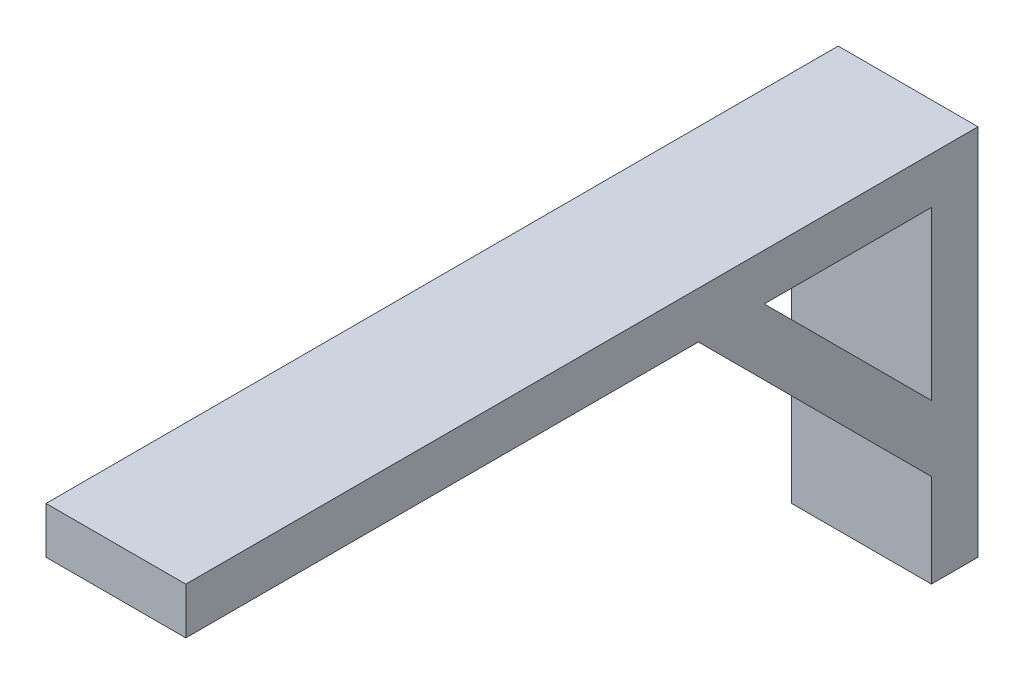
ISO-10303-21;
HEADER;
FILE_DESCRIPTION(('STEP AP214'),'2;1');
FILE_NAME('part.step','',(''),(''),'','','');
FILE_SCHEMA(('AUTOMOTIVE_DESIGN { 1 0 10303 214 1 1 1 1 }'));
ENDSEC;
DATA;
#1=APPLICATION_CONTEXT('core data for automotive mechanical design processes');
#2=APPLICATION_PROTOCOL_DEFINITION('international standard','automotive_design',2000,#1);
#3=PRODUCT_CONTEXT('',#1,'mechanical');
#4=PRODUCT('Part','Part','',(#3));
#5=PRODUCT_RELATED_PRODUCT_CATEGORY('part','',(#4));
#6=PRODUCT_DEFINITION_FORMATION('','',#4);
#7=PRODUCT_DEFINITION_CONTEXT('part definition',#1,'design');
#8=PRODUCT_DEFINITION('design','',#6,#7);
#9=PRODUCT_DEFINITION_SHAPE('','',#8);
#10=(LENGTH_UNIT() NAMED_UNIT(*) SI_UNIT(.MILLI.,.METRE.));
#11=(NAMED_UNIT(*) PLANE_ANGLE_UNIT() SI_UNIT($,.RADIAN.));
#12=(NAMED_UNIT(*) SI_UNIT($,.STERADIAN.) SOLID_ANGLE_UNIT());
#13=UNCERTAINTY_MEASURE_WITH_UNIT(LENGTH_MEASURE(1.E-05),#10,'distance_accuracy_value','');
#14=(GEOMETRIC_REPRESENTATION_CONTEXT(3) GLOBAL_UNCERTAINTY_ASSIGNED_CONTEXT((#13)) GLOBAL_UNIT_ASSIGNED_CONTEXT((#10,
#11,#12)) REPRESENTATION_CONTEXT('',''));
#15=CARTESIAN_POINT('',(0.,0.,0.));
#16=DIRECTION('',(0.,0.,1.));
#17=DIRECTION('',(1.,0.,0.));
#18=AXIS2_PLACEMENT_3D('',#15,#16,#17);
#19=CARTESIAN_POINT('',(76.2,0.,0.));
#20=DIRECTION('',(1.,0.,0.));
#21=DIRECTION('',(0.,0.,-1.));
#22=AXIS2_PLACEMENT_3D('',#19,#20,#21);
#23=PLANE('',#22);
#24=DIRECTION('',(0.,0.,-1.));
#25=VECTOR('',#24,1.);
#26=CARTESIAN_POINT('',(76.2,0.,25.4));
#27=LINE('',#26,#25);
#28=CARTESIAN_POINT('',(76.2,0.,25.4));
#29=VERTEX_POINT('',#28);
#30=CARTESIAN_POINT('',(76.2,0.,0.));
#31=VERTEX_POINT('',#30);
#32=EDGE_CURVE('E143',#29,#31,#27,.T.);
#33=ORIENTED_EDGE('',*,*,#32,.T.);
#34=DIRECTION('',(0.,1.,0.));
#35=VECTOR('',#34,1.);
#36=CARTESIAN_POINT('',(76.2,0.,0.));
#37=LINE('',#36,#35);
#38=CARTESIAN_POINT('',(76.2,203.2,0.));
#39=VERTEX_POINT('',#38);
#40=EDGE_CURVE('E146',#31,#39,#37,.T.);
#41=ORIENTED_EDGE('',*,*,#40,.T.);
#42=DIRECTION('',(0.,0.,1.));
#43=VECTOR('',#42,1.);
#44=CARTESIAN_POINT('',(76.2,203.2,0.));
#45=LINE('',#44,#43);
#46=CARTESIAN_POINT('',(76.2,203.2,431.8));
#47=VERTEX_POINT('',#46);
#48=EDGE_CURVE('E149',#39,#47,#45,.T.);
#49=ORIENTED_EDGE('',*,*,#48,.T.);
#50=DIRECTION('',(0.,-1.,0.));
#51=VECTOR('',#50,1.);
#52=CARTESIAN_POINT('',(76.2,203.2,431.8));
#53=LINE('',#52,#51);
#54=CARTESIAN_POINT('',(76.2,177.8,431.8));
#55=VERTEX_POINT('',#54);
#56=EDGE_CURVE('E151',#47,#55,#53,.T.);
#57=ORIENTED_EDGE('',*,*,#56,.T.);
#58=DIRECTION('',(0.,0.,-1.));
#59=VECTOR('',#58,1.);
#60=CARTESIAN_POINT('',(76.2,177.8,431.8));
#61=LINE('',#60,#59);
#62=CARTESIAN_POINT('',(76.2,177.8,152.4));
#63=VERTEX_POINT('',#62);
#64=EDGE_CURVE('E153',#55,#63,#61,.T.);
#65=ORIENTED_EDGE('',*,*,#64,.T.);
#66=DIRECTION('',(0.,-0.707106781186549,-0.707106781186546));
#67=VECTOR('',#66,1.);
#68=CARTESIAN_POINT('',(76.2,177.8,152.4));
#69=LINE('',#68,#67);
#70=CARTESIAN_POINT('',(76.2,50.8,25.4));
#71=VERTEX_POINT('',#70);
#72=EDGE_CURVE('E155',#63,#71,#69,.T.);
#73=ORIENTED_EDGE('',*,*,#72,.T.);
#74=DIRECTION('',(0.,-1.,0.));
#75=VECTOR('',#74,1.);
#76=CARTESIAN_POINT('',(76.2,50.8,25.4));
#77=LINE('',#76,#75);
#78=EDGE_CURVE('E157',#71,#29,#77,.T.);
#79=ORIENTED_EDGE('',*,*,#78,.T.);
#80=EDGE_LOOP('',(#33,#41,#49,#57,#65,#73,#79));
#81=FACE_BOUND('',#80,.T.);
#82=DIRECTION('',(0.,1.,0.));
#83=VECTOR('',#82,1.);
#84=CARTESIAN_POINT('',(76.2,177.8,25.4));
#85=LINE('',#84,#83);
#86=CARTESIAN_POINT('',(76.2,86.7210244842767,25.4));
#87=VERTEX_POINT('',#86);
#88=CARTESIAN_POINT('',(76.2,177.8,25.4));
#89=VERTEX_POINT('',#88);
#90=EDGE_CURVE('E124',#87,#89,#85,.T.);
#91=ORIENTED_EDGE('',*,*,#90,.F.);
#92=DIRECTION('',(0.,-0.707106781186549,-0.707106781186546));
#93=VECTOR('',#92,1.);
#94=CARTESIAN_POINT('',(76.2,86.7210244842767,25.4));
#95=LINE('',#94,#93);
#96=CARTESIAN_POINT('',(76.2,177.8,116.478975515723));
#97=VERTEX_POINT('',#96);
#98=EDGE_CURVE('E116',#97,#87,#95,.T.);
#99=ORIENTED_EDGE('',*,*,#98,.F.);
#100=DIRECTION('',(0.,0.,1.));
#101=VECTOR('',#100,1.);
#102=CARTESIAN_POINT('',(76.2,177.8,116.478975515723));
#103=LINE('',#102,#101);
#104=EDGE_CURVE('E133',#89,#97,#103,.T.);
#105=ORIENTED_EDGE('',*,*,#104,.F.);
#106=EDGE_LOOP('',(#91,#99,#105));
#107=FACE_BOUND('',#106,.T.);
#108=ADVANCED_FACE('F39',(#81,#107),#23,.T.);
#109=CARTESIAN_POINT('',(0.,0.,0.));
#110=DIRECTION('',(1.,0.,0.));
#111=DIRECTION('',(0.,0.,-1.));
#112=AXIS2_PLACEMENT_3D('',#109,#110,#111);
#113=PLANE('',#112);
#114=DIRECTION('',(0.,0.,-1.));
#115=VECTOR('',#114,1.);
#116=CARTESIAN_POINT('',(0.,0.,25.4));
#117=LINE('',#116,#115);
#118=CARTESIAN_POINT('',(0.,0.,25.4));
#119=VERTEX_POINT('',#118);
#120=CARTESIAN_POINT('',(0.,0.,0.));
#121=VERTEX_POINT('',#120);
#122=EDGE_CURVE('E131',#119,#121,#117,.T.);
#123=ORIENTED_EDGE('',*,*,#122,.F.);
#124=DIRECTION('',(0.,-1.,0.));
#125=VECTOR('',#124,1.);
#126=CARTESIAN_POINT('',(0.,50.8,25.4));
#127=LINE('',#126,#125);
#128=CARTESIAN_POINT('',(0.,50.8,25.4));
#129=VERTEX_POINT('',#128);
#130=EDGE_CURVE('E147',#129,#119,#127,.T.);
#131=ORIENTED_EDGE('',*,*,#130,.F.);
#132=DIRECTION('',(0.,-0.707106781186549,-0.707106781186546));
#133=VECTOR('',#132,1.);
#134=CARTESIAN_POINT('',(0.,177.8,152.4));
#135=LINE('',#134,#133);
#136=CARTESIAN_POINT('',(0.,177.8,152.4));
#137=VERTEX_POINT('',#136);
#138=EDGE_CURVE('E170',#137,#129,#135,.T.);
#139=ORIENTED_EDGE('',*,*,#138,.F.);
#140=DIRECTION('',(0.,0.,-1.));
#141=VECTOR('',#140,1.);
#142=CARTESIAN_POINT('',(0.,177.8,431.8));
#143=LINE('',#142,#141);
#144=CARTESIAN_POINT('',(0.,177.8,431.8));
#145=VERTEX_POINT('',#144);
#146=EDGE_CURVE('E168',#145,#137,#143,.T.);
#147=ORIENTED_EDGE('',*,*,#146,.F.);
#148=DIRECTION('',(0.,-1.,0.));
#149=VECTOR('',#148,1.);
#150=CARTESIAN_POINT('',(0.,203.2,431.8));
#151=LINE('',#150,#149);
#152=CARTESIAN_POINT('',(0.,203.2,431.8));
#153=VERTEX_POINT('',#152);
#154=EDGE_CURVE('E166',#153,#145,#151,.T.);
#155=ORIENTED_EDGE('',*,*,#154,.F.);
#156=DIRECTION('',(0.,0.,1.));
#157=VECTOR('',#156,1.);
#158=CARTESIAN_POINT('',(0.,203.2,0.));
#159=LINE('',#158,#157);
#160=CARTESIAN_POINT('',(0.,203.2,0.));
#161=VERTEX_POINT('',#160);
#162=EDGE_CURVE('E164',#161,#153,#159,.T.);
#163=ORIENTED_EDGE('',*,*,#162,.F.);
#164=DIRECTION('',(0.,1.,0.));
#165=VECTOR('',#164,1.);
#166=CARTESIAN_POINT('',(0.,0.,0.));
#167=LINE('',#166,#165);
#168=EDGE_CURVE('E162',#121,#161,#167,.T.);
#169=ORIENTED_EDGE('',*,*,#168,.F.);
#170=EDGE_LOOP('',(#123,#131,#139,#147,#155,#163,#169));
#171=FACE_BOUND('',#170,.T.);
#172=DIRECTION('',(0.,-0.707106781186549,-0.707106781186546));
#173=VECTOR('',#172,1.);
#174=CARTESIAN_POINT('',(0.,86.7210244842767,25.4));
#175=LINE('',#174,#173);
#176=CARTESIAN_POINT('',(0.,177.8,116.478975515723));
#177=VERTEX_POINT('',#176);
#178=CARTESIAN_POINT('',(0.,86.7210244842767,25.4));
#179=VERTEX_POINT('',#178);
#180=EDGE_CURVE('E62',#177,#179,#175,.T.);
#181=ORIENTED_EDGE('',*,*,#180,.T.);
#182=DIRECTION('',(0.,1.,0.));
#183=VECTOR('',#182,1.);
#184=CARTESIAN_POINT('',(0.,177.8,25.4));
#185=LINE('',#184,#183);
#186=CARTESIAN_POINT('',(0.,177.8,25.4));
#187=VERTEX_POINT('',#186);
#188=EDGE_CURVE('E130',#179,#187,#185,.T.);
#189=ORIENTED_EDGE('',*,*,#188,.T.);
#190=DIRECTION('',(0.,0.,1.));
#191=VECTOR('',#190,1.);
#192=CARTESIAN_POINT('',(0.,177.8,116.478975515723));
#193=LINE('',#192,#191);
#194=EDGE_CURVE('E125',#187,#177,#193,.T.);
#195=ORIENTED_EDGE('',*,*,#194,.T.);
#196=EDGE_LOOP('',(#181,#189,#195));
#197=FACE_BOUND('',#196,.T.);
#198=ADVANCED_FACE('F197',(#171,#197),#113,.F.);
#199=CARTESIAN_POINT('',(76.2,0.,25.4));
#200=DIRECTION('',(0.,1.,0.));
#201=DIRECTION('',(0.,0.,1.));
#202=AXIS2_PLACEMENT_3D('',#199,#200,#201);
#203=PLANE('',#202);
#204=ORIENTED_EDGE('',*,*,#122,.T.);
#205=DIRECTION('',(-1.,0.,0.));
#206=VECTOR('',#205,1.);
#207=CARTESIAN_POINT('',(76.2,0.,0.));
#208=LINE('',#207,#206);
#209=EDGE_CURVE('E11',#31,#121,#208,.T.);
#210=ORIENTED_EDGE('',*,*,#209,.F.);
#211=ORIENTED_EDGE('',*,*,#32,.F.);
#212=DIRECTION('',(-1.,0.,0.));
#213=VECTOR('',#212,1.);
#214=CARTESIAN_POINT('',(76.2,0.,25.4));
#215=LINE('',#214,#213);
#216=EDGE_CURVE('E159',#29,#119,#215,.T.);
#217=ORIENTED_EDGE('',*,*,#216,.T.);
#218=EDGE_LOOP('',(#204,#210,#211,#217));
#219=FACE_BOUND('',#218,.T.);
#220=ADVANCED_FACE('F41',(#219),#203,.F.);
#221=CARTESIAN_POINT('',(76.2,0.,0.));
#222=DIRECTION('',(0.,0.,1.));
#223=DIRECTION('',(1.,0.,0.));
#224=AXIS2_PLACEMENT_3D('',#221,#222,#223);
#225=PLANE('',#224);
#226=ORIENTED_EDGE('',*,*,#168,.T.);
#227=DIRECTION('',(-1.,0.,0.));
#228=VECTOR('',#227,1.);
#229=CARTESIAN_POINT('',(76.2,203.2,0.));
#230=LINE('',#229,#228);
#231=EDGE_CURVE('E47',#39,#161,#230,.T.);
#232=ORIENTED_EDGE('',*,*,#231,.F.);
#233=ORIENTED_EDGE('',*,*,#40,.F.);
#234=ORIENTED_EDGE('',*,*,#209,.T.);
#235=EDGE_LOOP('',(#226,#232,#233,#234));
#236=FACE_BOUND('',#235,.T.);
#237=ADVANCED_FACE('F214',(#236),#225,.F.);
#238=CARTESIAN_POINT('',(76.2,203.2,0.));
#239=DIRECTION('',(0.,-1.,0.));
#240=DIRECTION('',(0.,0.,-1.));
#241=AXIS2_PLACEMENT_3D('',#238,#239,#240);
#242=PLANE('',#241);
#243=ORIENTED_EDGE('',*,*,#162,.T.);
#244=DIRECTION('',(-1.,0.,0.));
#245=VECTOR('',#244,1.);
#246=CARTESIAN_POINT('',(76.2,203.2,431.8));
#247=LINE('',#246,#245);
#248=EDGE_CURVE('E184',#47,#153,#247,.T.);
#249=ORIENTED_EDGE('',*,*,#248,.F.);
#250=ORIENTED_EDGE('',*,*,#48,.F.);
#251=ORIENTED_EDGE('',*,*,#231,.T.);
#252=EDGE_LOOP('',(#243,#249,#250,#251));
#253=FACE_BOUND('',#252,.T.);
#254=ADVANCED_FACE('F191',(#253),#242,.F.);
#255=CARTESIAN_POINT('',(76.2,203.2,431.8));
#256=DIRECTION('',(0.,0.,-1.));
#257=DIRECTION('',(-1.,0.,0.));
#258=AXIS2_PLACEMENT_3D('',#255,#256,#257);
#259=PLANE('',#258);
#260=ORIENTED_EDGE('',*,*,#154,.T.);
#261=DIRECTION('',(-1.,0.,0.));
#262=VECTOR('',#261,1.);
#263=CARTESIAN_POINT('',(76.2,177.8,431.8));
#264=LINE('',#263,#262);
#265=EDGE_CURVE('E181',#55,#145,#264,.T.);
#266=ORIENTED_EDGE('',*,*,#265,.F.);
#267=ORIENTED_EDGE('',*,*,#56,.F.);
#268=ORIENTED_EDGE('',*,*,#248,.T.);
#269=EDGE_LOOP('',(#260,#266,#267,#268));
#270=FACE_BOUND('',#269,.T.);
#271=ADVANCED_FACE('F203',(#270),#259,.F.);
#272=CARTESIAN_POINT('',(76.2,177.8,431.8));
#273=DIRECTION('',(0.,1.,0.));
#274=DIRECTION('',(0.,0.,1.));
#275=AXIS2_PLACEMENT_3D('',#272,#273,#274);
#276=PLANE('',#275);
#277=ORIENTED_EDGE('',*,*,#146,.T.);
#278=DIRECTION('',(-1.,0.,0.));
#279=VECTOR('',#278,1.);
#280=CARTESIAN_POINT('',(76.2,177.8,152.4));
#281=LINE('',#280,#279);
#282=EDGE_CURVE('E178',#63,#137,#281,.T.);
#283=ORIENTED_EDGE('',*,*,#282,.F.);
#284=ORIENTED_EDGE('',*,*,#64,.F.);
#285=ORIENTED_EDGE('',*,*,#265,.T.);
#286=EDGE_LOOP('',(#277,#283,#284,#285));
#287=FACE_BOUND('',#286,.T.);
#288=ADVANCED_FACE('F207',(#287),#276,.F.);
#289=CARTESIAN_POINT('',(76.2,177.8,152.4));
#290=DIRECTION('',(0.,0.707106781186546,-0.707106781186549));
#291=DIRECTION('',(0.,0.707106781186549,0.707106781186546));
#292=AXIS2_PLACEMENT_3D('',#289,#290,#291);
#293=PLANE('',#292);
#294=ORIENTED_EDGE('',*,*,#138,.T.);
#295=DIRECTION('',(-1.,0.,0.));
#296=VECTOR('',#295,1.);
#297=CARTESIAN_POINT('',(76.2,50.8,25.4));
#298=LINE('',#297,#296);
#299=EDGE_CURVE('E175',#71,#129,#298,.T.);
#300=ORIENTED_EDGE('',*,*,#299,.F.);
#301=ORIENTED_EDGE('',*,*,#72,.F.);
#302=ORIENTED_EDGE('',*,*,#282,.T.);
#303=EDGE_LOOP('',(#294,#300,#301,#302));
#304=FACE_BOUND('',#303,.T.);
#305=ADVANCED_FACE('F222',(#304),#293,.F.);
#306=CARTESIAN_POINT('',(76.2,50.8,25.4));
#307=DIRECTION('',(0.,0.,-1.));
#308=DIRECTION('',(0.,1.,0.));
#309=AXIS2_PLACEMENT_3D('',#306,#307,#308);
#310=PLANE('',#309);
#311=ORIENTED_EDGE('',*,*,#130,.T.);
#312=ORIENTED_EDGE('',*,*,#216,.F.);
#313=ORIENTED_EDGE('',*,*,#78,.F.);
#314=ORIENTED_EDGE('',*,*,#299,.T.);
#315=EDGE_LOOP('',(#311,#312,#313,#314));
#316=FACE_BOUND('',#315,.T.);
#317=ADVANCED_FACE('F219',(#316),#310,.F.);
#318=CARTESIAN_POINT('',(76.2,86.7210244842767,25.4));
#319=DIRECTION('',(0.,0.707106781186546,-0.707106781186549));
#320=DIRECTION('',(0.,0.707106781186549,0.707106781186546));
#321=AXIS2_PLACEMENT_3D('',#318,#319,#320);
#322=PLANE('',#321);
#323=ORIENTED_EDGE('',*,*,#180,.F.);
#324=DIRECTION('',(-1.,0.,0.));
#325=VECTOR('',#324,1.);
#326=CARTESIAN_POINT('',(76.2,177.8,116.478975515723));
#327=LINE('',#326,#325);
#328=EDGE_CURVE('E120',#97,#177,#327,.T.);
#329=ORIENTED_EDGE('',*,*,#328,.F.);
#330=ORIENTED_EDGE('',*,*,#98,.T.);
#331=DIRECTION('',(-1.,0.,0.));
#332=VECTOR('',#331,1.);
#333=CARTESIAN_POINT('',(76.2,86.7210244842767,25.4));
#334=LINE('',#333,#332);
#335=EDGE_CURVE('E119',#87,#179,#334,.T.);
#336=ORIENTED_EDGE('',*,*,#335,.T.);
#337=EDGE_LOOP('',(#323,#329,#330,#336));
#338=FACE_BOUND('',#337,.T.);
#339=ADVANCED_FACE('F118',(#338),#322,.T.);
#340=CARTESIAN_POINT('',(76.2,177.8,25.4));
#341=DIRECTION('',(0.,0.,1.));
#342=DIRECTION('',(0.,-1.,0.));
#343=AXIS2_PLACEMENT_3D('',#340,#341,#342);
#344=PLANE('',#343);
#345=ORIENTED_EDGE('',*,*,#188,.F.);
#346=ORIENTED_EDGE('',*,*,#335,.F.);
#347=ORIENTED_EDGE('',*,*,#90,.T.);
#348=DIRECTION('',(-1.,0.,0.));
#349=VECTOR('',#348,1.);
#350=CARTESIAN_POINT('',(76.2,177.8,25.4));
#351=LINE('',#350,#349);
#352=EDGE_CURVE('E54',#89,#187,#351,.T.);
#353=ORIENTED_EDGE('',*,*,#352,.T.);
#354=EDGE_LOOP('',(#345,#346,#347,#353));
#355=FACE_BOUND('',#354,.T.);
#356=ADVANCED_FACE('F128',(#355),#344,.T.);
#357=CARTESIAN_POINT('',(76.2,177.8,116.478975515723));
#358=DIRECTION('',(0.,-1.,0.));
#359=DIRECTION('',(0.,0.,-1.));
#360=AXIS2_PLACEMENT_3D('',#357,#358,#359);
#361=PLANE('',#360);
#362=ORIENTED_EDGE('',*,*,#194,.F.);
#363=ORIENTED_EDGE('',*,*,#352,.F.);
#364=ORIENTED_EDGE('',*,*,#104,.T.);
#365=ORIENTED_EDGE('',*,*,#328,.T.);
#366=EDGE_LOOP('',(#362,#363,#364,#365));
#367=FACE_BOUND('',#366,.T.);
#368=ADVANCED_FACE('F242',(#367),#361,.T.);
#369=CLOSED_SHELL('',(#108,#198,#220,#237,#254,#271,#288,#305,#317,#339,#356,#368));
#370=MANIFOLD_SOLID_BREP('B2',#369);
#371=ADVANCED_BREP_SHAPE_REPRESENTATION('',(#18,#370),#14);
#372=SHAPE_DEFINITION_REPRESENTATION(#9,#371);
ENDSEC;
END-ISO-10303-21;
